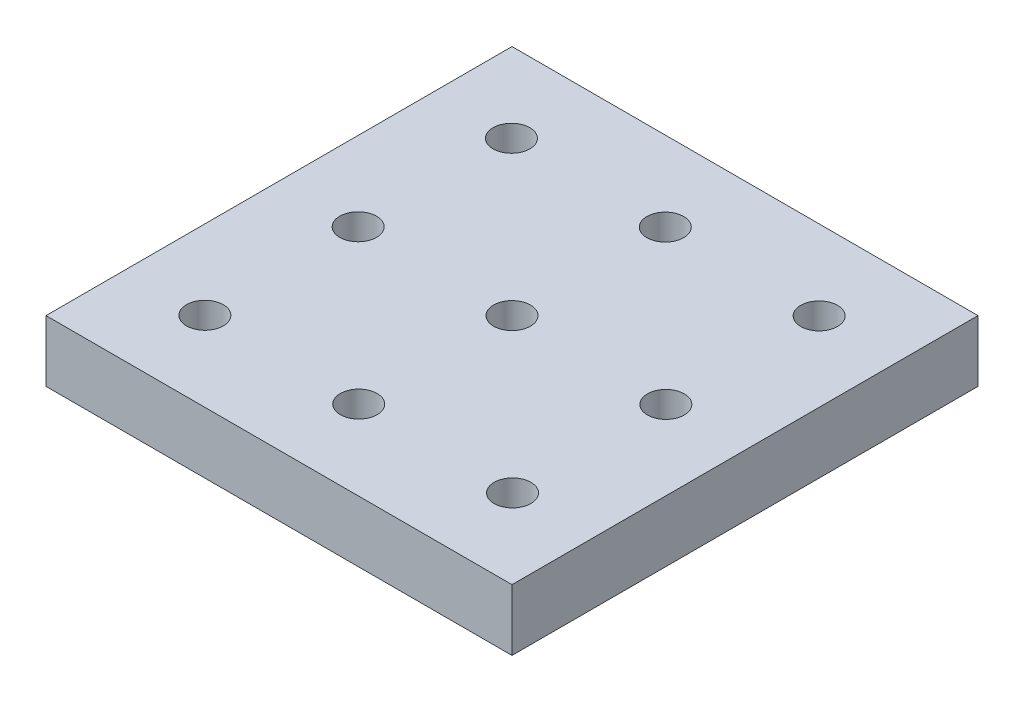
ISO-10303-21;
HEADER;
FILE_DESCRIPTION(('STEP AP214'),'2;1');
FILE_NAME('part.step','',(''),(''),'','','');
FILE_SCHEMA(('AUTOMOTIVE_DESIGN { 1 0 10303 214 1 1 1 1 }'));
ENDSEC;
DATA;
#1=APPLICATION_CONTEXT('core data for automotive mechanical design processes');
#2=APPLICATION_PROTOCOL_DEFINITION('international standard','automotive_design',2000,#1);
#3=PRODUCT_CONTEXT('',#1,'mechanical');
#4=PRODUCT('Part','Part','',(#3));
#5=PRODUCT_RELATED_PRODUCT_CATEGORY('part','',(#4));
#6=PRODUCT_DEFINITION_FORMATION('','',#4);
#7=PRODUCT_DEFINITION_CONTEXT('part definition',#1,'design');
#8=PRODUCT_DEFINITION('design','',#6,#7);
#9=PRODUCT_DEFINITION_SHAPE('','',#8);
#10=(LENGTH_UNIT() NAMED_UNIT(*) SI_UNIT(.MILLI.,.METRE.));
#11=(NAMED_UNIT(*) PLANE_ANGLE_UNIT() SI_UNIT($,.RADIAN.));
#12=(NAMED_UNIT(*) SI_UNIT($,.STERADIAN.) SOLID_ANGLE_UNIT());
#13=UNCERTAINTY_MEASURE_WITH_UNIT(LENGTH_MEASURE(1.E-05),#10,'distance_accuracy_value','');
#14=(GEOMETRIC_REPRESENTATION_CONTEXT(3) GLOBAL_UNCERTAINTY_ASSIGNED_CONTEXT((#13)) GLOBAL_UNIT_ASSIGNED_CONTEXT((#10,
#11,#12)) REPRESENTATION_CONTEXT('',''));
#15=CARTESIAN_POINT('',(0.,0.,0.));
#16=DIRECTION('',(0.,0.,1.));
#17=DIRECTION('',(1.,0.,0.));
#18=AXIS2_PLACEMENT_3D('',#15,#16,#17);
#19=CARTESIAN_POINT('',(0.,10.,0.));
#20=DIRECTION('',(0.,1.,0.));
#21=DIRECTION('',(0.,0.,1.));
#22=AXIS2_PLACEMENT_3D('',#19,#20,#21);
#23=PLANE('',#22);
#24=CARTESIAN_POINT('',(-159.859666299944,10.,-56.7102196791404));
#25=DIRECTION('',(0.,1.,0.));
#26=DIRECTION('',(0.,0.,-1.));
#27=AXIS2_PLACEMENT_3D('',#24,#25,#26);
#28=CIRCLE('',#27,2.99999999999999);
#29=CARTESIAN_POINT('',(-159.859666299944,10.,-59.7102196791404));
#30=VERTEX_POINT('',#29);
#31=EDGE_CURVE('E150',#30,#30,#28,.T.);
#32=ORIENTED_EDGE('',*,*,#31,.F.);
#33=EDGE_LOOP('',(#32));
#34=FACE_BOUND('',#33,.T.);
#35=CARTESIAN_POINT('',(-134.769453056282,10.,-106.71021967914));
#36=DIRECTION('',(0.,1.,0.));
#37=DIRECTION('',(0.,0.,1.));
#38=AXIS2_PLACEMENT_3D('',#35,#36,#37);
#39=CIRCLE('',#38,2.99999999999999);
#40=CARTESIAN_POINT('',(-134.769453056282,10.,-103.71021967914));
#41=VERTEX_POINT('',#40);
#42=EDGE_CURVE('E138',#41,#41,#39,.T.);
#43=ORIENTED_EDGE('',*,*,#42,.F.);
#44=EDGE_LOOP('',(#43));
#45=FACE_BOUND('',#44,.T.);
#46=CARTESIAN_POINT('',(-134.769453056282,10.,-56.7102196791404));
#47=DIRECTION('',(0.,1.,0.));
#48=DIRECTION('',(0.,0.,-1.));
#49=AXIS2_PLACEMENT_3D('',#46,#47,#48);
#50=CIRCLE('',#49,2.99999999999999);
#51=CARTESIAN_POINT('',(-134.769453056282,10.,-59.7102196791404));
#52=VERTEX_POINT('',#51);
#53=EDGE_CURVE('E126',#52,#52,#50,.T.);
#54=ORIENTED_EDGE('',*,*,#53,.F.);
#55=EDGE_LOOP('',(#54));
#56=FACE_BOUND('',#55,.T.);
#57=CARTESIAN_POINT('',(-134.769453056282,10.,-81.7102196791404));
#58=DIRECTION('',(0.,1.,0.));
#59=DIRECTION('',(0.,0.,1.));
#60=AXIS2_PLACEMENT_3D('',#57,#58,#59);
#61=CIRCLE('',#60,3.00000000000002);
#62=CARTESIAN_POINT('',(-134.769453056282,10.,-78.7102196791404));
#63=VERTEX_POINT('',#62);
#64=EDGE_CURVE('E114',#63,#63,#61,.T.);
#65=ORIENTED_EDGE('',*,*,#64,.F.);
#66=EDGE_LOOP('',(#65));
#67=FACE_BOUND('',#66,.T.);
#68=DIRECTION('',(1.,0.,0.));
#69=VECTOR('',#68,1.);
#70=CARTESIAN_POINT('',(-197.859666299944,10.,-43.7102196791404));
#71=LINE('',#70,#69);
#72=CARTESIAN_POINT('',(-197.859666299944,10.,-43.7102196791404));
#73=VERTEX_POINT('',#72);
#74=CARTESIAN_POINT('',(-121.859666299944,10.,-43.7102196791404));
#75=VERTEX_POINT('',#74);
#76=EDGE_CURVE('E84',#73,#75,#71,.T.);
#77=ORIENTED_EDGE('',*,*,#76,.T.);
#78=DIRECTION('',(0.,0.,-1.));
#79=VECTOR('',#78,1.);
#80=CARTESIAN_POINT('',(-121.859666299944,10.,-43.7102196791404));
#81=LINE('',#80,#79);
#82=CARTESIAN_POINT('',(-121.859666299944,10.,-119.71021967914));
#83=VERTEX_POINT('',#82);
#84=EDGE_CURVE('E79',#75,#83,#81,.T.);
#85=ORIENTED_EDGE('',*,*,#84,.T.);
#86=DIRECTION('',(-1.,0.,0.));
#87=VECTOR('',#86,1.);
#88=CARTESIAN_POINT('',(-121.859666299944,10.,-119.71021967914));
#89=LINE('',#88,#87);
#90=CARTESIAN_POINT('',(-197.859666299944,10.,-119.71021967914));
#91=VERTEX_POINT('',#90);
#92=EDGE_CURVE('E82',#83,#91,#89,.T.);
#93=ORIENTED_EDGE('',*,*,#92,.T.);
#94=DIRECTION('',(0.,0.,1.));
#95=VECTOR('',#94,1.);
#96=CARTESIAN_POINT('',(-197.859666299944,10.,-119.71021967914));
#97=LINE('',#96,#95);
#98=EDGE_CURVE('E49',#91,#73,#97,.T.);
#99=ORIENTED_EDGE('',*,*,#98,.T.);
#100=EDGE_LOOP('',(#77,#85,#93,#99));
#101=FACE_BOUND('',#100,.T.);
#102=CARTESIAN_POINT('',(-159.859666299944,10.,-81.7102196791404));
#103=DIRECTION('',(0.,1.,0.));
#104=DIRECTION('',(0.,0.,1.));
#105=AXIS2_PLACEMENT_3D('',#102,#103,#104);
#106=CIRCLE('',#105,2.99999999999999);
#107=CARTESIAN_POINT('',(-159.859666299944,10.,-78.7102196791404));
#108=VERTEX_POINT('',#107);
#109=EDGE_CURVE('E99',#108,#108,#106,.T.);
#110=ORIENTED_EDGE('',*,*,#109,.F.);
#111=EDGE_LOOP('',(#110));
#112=FACE_BOUND('',#111,.T.);
#113=CARTESIAN_POINT('',(-184.949879543606,10.,-81.7102196791404));
#114=DIRECTION('',(0.,1.,0.));
#115=DIRECTION('',(0.,0.,-1.));
#116=AXIS2_PLACEMENT_3D('',#113,#114,#115);
#117=CIRCLE('',#116,3.00000000000002);
#118=CARTESIAN_POINT('',(-184.949879543606,10.,-84.7102196791404));
#119=VERTEX_POINT('',#118);
#120=EDGE_CURVE('E120',#119,#119,#117,.T.);
#121=ORIENTED_EDGE('',*,*,#120,.F.);
#122=EDGE_LOOP('',(#121));
#123=FACE_BOUND('',#122,.T.);
#124=CARTESIAN_POINT('',(-159.859666299944,10.,-106.71021967914));
#125=DIRECTION('',(0.,1.,0.));
#126=DIRECTION('',(0.,0.,1.));
#127=AXIS2_PLACEMENT_3D('',#124,#125,#126);
#128=CIRCLE('',#127,2.99999999999999);
#129=CARTESIAN_POINT('',(-159.859666299944,10.,-103.71021967914));
#130=VERTEX_POINT('',#129);
#131=EDGE_CURVE('E132',#130,#130,#128,.T.);
#132=ORIENTED_EDGE('',*,*,#131,.F.);
#133=EDGE_LOOP('',(#132));
#134=FACE_BOUND('',#133,.T.);
#135=CARTESIAN_POINT('',(-184.949879543606,10.,-106.71021967914));
#136=DIRECTION('',(0.,1.,0.));
#137=DIRECTION('',(0.,0.,-1.));
#138=AXIS2_PLACEMENT_3D('',#135,#136,#137);
#139=CIRCLE('',#138,3.00000000000002);
#140=CARTESIAN_POINT('',(-184.949879543606,10.,-109.71021967914));
#141=VERTEX_POINT('',#140);
#142=EDGE_CURVE('E144',#141,#141,#139,.T.);
#143=ORIENTED_EDGE('',*,*,#142,.F.);
#144=EDGE_LOOP('',(#143));
#145=FACE_BOUND('',#144,.T.);
#146=CARTESIAN_POINT('',(-184.949879543606,10.,-56.7102196791404));
#147=DIRECTION('',(0.,1.,0.));
#148=DIRECTION('',(0.,0.,1.));
#149=AXIS2_PLACEMENT_3D('',#146,#147,#148);
#150=CIRCLE('',#149,3.00000000000002);
#151=CARTESIAN_POINT('',(-184.949879543606,10.,-53.7102196791404));
#152=VERTEX_POINT('',#151);
#153=EDGE_CURVE('E156',#152,#152,#150,.T.);
#154=ORIENTED_EDGE('',*,*,#153,.F.);
#155=EDGE_LOOP('',(#154));
#156=FACE_BOUND('',#155,.T.);
#157=ADVANCED_FACE('F32',(#34,#45,#56,#67,#101,#112,#123,#134,#145,#156),#23,.T.);
#158=CARTESIAN_POINT('',(0.,0.,0.));
#159=DIRECTION('',(0.,1.,0.));
#160=DIRECTION('',(0.,0.,1.));
#161=AXIS2_PLACEMENT_3D('',#158,#159,#160);
#162=PLANE('',#161);
#163=CARTESIAN_POINT('',(-159.859666299944,0.,-56.7102196791404));
#164=DIRECTION('',(0.,1.,0.));
#165=DIRECTION('',(0.,0.,-1.));
#166=AXIS2_PLACEMENT_3D('',#163,#164,#165);
#167=CIRCLE('',#166,2.99999999999999);
#168=CARTESIAN_POINT('',(-159.859666299944,0.,-59.7102196791404));
#169=VERTEX_POINT('',#168);
#170=EDGE_CURVE('E153',#169,#169,#167,.T.);
#171=ORIENTED_EDGE('',*,*,#170,.T.);
#172=EDGE_LOOP('',(#171));
#173=FACE_BOUND('',#172,.T.);
#174=CARTESIAN_POINT('',(-134.769453056282,0.,-106.71021967914));
#175=DIRECTION('',(0.,1.,0.));
#176=DIRECTION('',(0.,0.,1.));
#177=AXIS2_PLACEMENT_3D('',#174,#175,#176);
#178=CIRCLE('',#177,2.99999999999999);
#179=CARTESIAN_POINT('',(-134.769453056282,0.,-103.71021967914));
#180=VERTEX_POINT('',#179);
#181=EDGE_CURVE('E141',#180,#180,#178,.T.);
#182=ORIENTED_EDGE('',*,*,#181,.T.);
#183=EDGE_LOOP('',(#182));
#184=FACE_BOUND('',#183,.T.);
#185=CARTESIAN_POINT('',(-134.769453056282,0.,-56.7102196791404));
#186=DIRECTION('',(0.,1.,0.));
#187=DIRECTION('',(0.,0.,-1.));
#188=AXIS2_PLACEMENT_3D('',#185,#186,#187);
#189=CIRCLE('',#188,2.99999999999999);
#190=CARTESIAN_POINT('',(-134.769453056282,0.,-59.7102196791404));
#191=VERTEX_POINT('',#190);
#192=EDGE_CURVE('E129',#191,#191,#189,.T.);
#193=ORIENTED_EDGE('',*,*,#192,.T.);
#194=EDGE_LOOP('',(#193));
#195=FACE_BOUND('',#194,.T.);
#196=CARTESIAN_POINT('',(-134.769453056282,0.,-81.7102196791404));
#197=DIRECTION('',(0.,1.,0.));
#198=DIRECTION('',(0.,0.,1.));
#199=AXIS2_PLACEMENT_3D('',#196,#197,#198);
#200=CIRCLE('',#199,3.00000000000002);
#201=CARTESIAN_POINT('',(-134.769453056282,0.,-78.7102196791404));
#202=VERTEX_POINT('',#201);
#203=EDGE_CURVE('E117',#202,#202,#200,.T.);
#204=ORIENTED_EDGE('',*,*,#203,.T.);
#205=EDGE_LOOP('',(#204));
#206=FACE_BOUND('',#205,.T.);
#207=DIRECTION('',(1.,0.,0.));
#208=VECTOR('',#207,1.);
#209=CARTESIAN_POINT('',(-197.859666299944,0.,-43.7102196791404));
#210=LINE('',#209,#208);
#211=CARTESIAN_POINT('',(-197.859666299944,0.,-43.7102196791404));
#212=VERTEX_POINT('',#211);
#213=CARTESIAN_POINT('',(-121.859666299944,0.,-43.7102196791404));
#214=VERTEX_POINT('',#213);
#215=EDGE_CURVE('E96',#212,#214,#210,.T.);
#216=ORIENTED_EDGE('',*,*,#215,.F.);
#217=DIRECTION('',(0.,0.,1.));
#218=VECTOR('',#217,1.);
#219=CARTESIAN_POINT('',(-197.859666299944,0.,-119.71021967914));
#220=LINE('',#219,#218);
#221=CARTESIAN_POINT('',(-197.859666299944,0.,-119.71021967914));
#222=VERTEX_POINT('',#221);
#223=EDGE_CURVE('E72',#222,#212,#220,.T.);
#224=ORIENTED_EDGE('',*,*,#223,.F.);
#225=DIRECTION('',(-1.,0.,0.));
#226=VECTOR('',#225,1.);
#227=CARTESIAN_POINT('',(-121.859666299944,0.,-119.71021967914));
#228=LINE('',#227,#226);
#229=CARTESIAN_POINT('',(-121.859666299944,0.,-119.71021967914));
#230=VERTEX_POINT('',#229);
#231=EDGE_CURVE('E66',#230,#222,#228,.T.);
#232=ORIENTED_EDGE('',*,*,#231,.F.);
#233=DIRECTION('',(0.,0.,-1.));
#234=VECTOR('',#233,1.);
#235=CARTESIAN_POINT('',(-121.859666299944,0.,-43.7102196791404));
#236=LINE('',#235,#234);
#237=EDGE_CURVE('E88',#214,#230,#236,.T.);
#238=ORIENTED_EDGE('',*,*,#237,.F.);
#239=EDGE_LOOP('',(#216,#224,#232,#238));
#240=FACE_BOUND('',#239,.T.);
#241=CARTESIAN_POINT('',(-159.859666299944,0.,-81.7102196791404));
#242=DIRECTION('',(0.,1.,0.));
#243=DIRECTION('',(0.,0.,1.));
#244=AXIS2_PLACEMENT_3D('',#241,#242,#243);
#245=CIRCLE('',#244,2.99999999999999);
#246=CARTESIAN_POINT('',(-159.859666299944,0.,-78.7102196791404));
#247=VERTEX_POINT('',#246);
#248=EDGE_CURVE('E111',#247,#247,#245,.T.);
#249=ORIENTED_EDGE('',*,*,#248,.T.);
#250=EDGE_LOOP('',(#249));
#251=FACE_BOUND('',#250,.T.);
#252=CARTESIAN_POINT('',(-184.949879543606,0.,-81.7102196791404));
#253=DIRECTION('',(0.,1.,0.));
#254=DIRECTION('',(0.,0.,-1.));
#255=AXIS2_PLACEMENT_3D('',#252,#253,#254);
#256=CIRCLE('',#255,3.00000000000002);
#257=CARTESIAN_POINT('',(-184.949879543606,0.,-84.7102196791404));
#258=VERTEX_POINT('',#257);
#259=EDGE_CURVE('E123',#258,#258,#256,.T.);
#260=ORIENTED_EDGE('',*,*,#259,.T.);
#261=EDGE_LOOP('',(#260));
#262=FACE_BOUND('',#261,.T.);
#263=CARTESIAN_POINT('',(-159.859666299944,0.,-106.71021967914));
#264=DIRECTION('',(0.,1.,0.));
#265=DIRECTION('',(0.,0.,1.));
#266=AXIS2_PLACEMENT_3D('',#263,#264,#265);
#267=CIRCLE('',#266,2.99999999999999);
#268=CARTESIAN_POINT('',(-159.859666299944,0.,-103.71021967914));
#269=VERTEX_POINT('',#268);
#270=EDGE_CURVE('E135',#269,#269,#267,.T.);
#271=ORIENTED_EDGE('',*,*,#270,.T.);
#272=EDGE_LOOP('',(#271));
#273=FACE_BOUND('',#272,.T.);
#274=CARTESIAN_POINT('',(-184.949879543606,0.,-106.71021967914));
#275=DIRECTION('',(0.,1.,0.));
#276=DIRECTION('',(0.,0.,-1.));
#277=AXIS2_PLACEMENT_3D('',#274,#275,#276);
#278=CIRCLE('',#277,3.00000000000002);
#279=CARTESIAN_POINT('',(-184.949879543606,0.,-109.71021967914));
#280=VERTEX_POINT('',#279);
#281=EDGE_CURVE('E147',#280,#280,#278,.T.);
#282=ORIENTED_EDGE('',*,*,#281,.T.);
#283=EDGE_LOOP('',(#282));
#284=FACE_BOUND('',#283,.T.);
#285=CARTESIAN_POINT('',(-184.949879543606,0.,-56.7102196791404));
#286=DIRECTION('',(0.,1.,0.));
#287=DIRECTION('',(0.,0.,1.));
#288=AXIS2_PLACEMENT_3D('',#285,#286,#287);
#289=CIRCLE('',#288,3.00000000000002);
#290=CARTESIAN_POINT('',(-184.949879543606,0.,-53.7102196791404));
#291=VERTEX_POINT('',#290);
#292=EDGE_CURVE('E159',#291,#291,#289,.T.);
#293=ORIENTED_EDGE('',*,*,#292,.T.);
#294=EDGE_LOOP('',(#293));
#295=FACE_BOUND('',#294,.T.);
#296=ADVANCED_FACE('F107',(#173,#184,#195,#206,#240,#251,#262,#273,#284,#295),#162,.F.);
#297=CARTESIAN_POINT('',(-197.859666299944,10.,-43.7102196791404));
#298=DIRECTION('',(0.,0.,-1.));
#299=DIRECTION('',(-1.,0.,0.));
#300=AXIS2_PLACEMENT_3D('',#297,#298,#299);
#301=PLANE('',#300);
#302=ORIENTED_EDGE('',*,*,#215,.T.);
#303=DIRECTION('',(0.,-1.,0.));
#304=VECTOR('',#303,1.);
#305=CARTESIAN_POINT('',(-121.859666299944,10.,-43.7102196791404));
#306=LINE('',#305,#304);
#307=EDGE_CURVE('E11',#75,#214,#306,.T.);
#308=ORIENTED_EDGE('',*,*,#307,.F.);
#309=ORIENTED_EDGE('',*,*,#76,.F.);
#310=DIRECTION('',(0.,-1.,0.));
#311=VECTOR('',#310,1.);
#312=CARTESIAN_POINT('',(-197.859666299944,10.,-43.7102196791404));
#313=LINE('',#312,#311);
#314=EDGE_CURVE('E92',#73,#212,#313,.T.);
#315=ORIENTED_EDGE('',*,*,#314,.T.);
#316=EDGE_LOOP('',(#302,#308,#309,#315));
#317=FACE_BOUND('',#316,.T.);
#318=ADVANCED_FACE('F34',(#317),#301,.F.);
#319=CARTESIAN_POINT('',(-121.859666299944,10.,-43.7102196791404));
#320=DIRECTION('',(-1.,0.,0.));
#321=DIRECTION('',(0.,0.,1.));
#322=AXIS2_PLACEMENT_3D('',#319,#320,#321);
#323=PLANE('',#322);
#324=ORIENTED_EDGE('',*,*,#237,.T.);
#325=DIRECTION('',(0.,-1.,0.));
#326=VECTOR('',#325,1.);
#327=CARTESIAN_POINT('',(-121.859666299944,10.,-119.71021967914));
#328=LINE('',#327,#326);
#329=EDGE_CURVE('E41',#83,#230,#328,.T.);
#330=ORIENTED_EDGE('',*,*,#329,.F.);
#331=ORIENTED_EDGE('',*,*,#84,.F.);
#332=ORIENTED_EDGE('',*,*,#307,.T.);
#333=EDGE_LOOP('',(#324,#330,#331,#332));
#334=FACE_BOUND('',#333,.T.);
#335=ADVANCED_FACE('F87',(#334),#323,.F.);
#336=CARTESIAN_POINT('',(-121.859666299944,10.,-119.71021967914));
#337=DIRECTION('',(0.,0.,1.));
#338=DIRECTION('',(1.,0.,0.));
#339=AXIS2_PLACEMENT_3D('',#336,#337,#338);
#340=PLANE('',#339);
#341=ORIENTED_EDGE('',*,*,#231,.T.);
#342=DIRECTION('',(0.,-1.,0.));
#343=VECTOR('',#342,1.);
#344=CARTESIAN_POINT('',(-197.859666299944,10.,-119.71021967914));
#345=LINE('',#344,#343);
#346=EDGE_CURVE('E89',#91,#222,#345,.T.);
#347=ORIENTED_EDGE('',*,*,#346,.F.);
#348=ORIENTED_EDGE('',*,*,#92,.F.);
#349=ORIENTED_EDGE('',*,*,#329,.T.);
#350=EDGE_LOOP('',(#341,#347,#348,#349));
#351=FACE_BOUND('',#350,.T.);
#352=ADVANCED_FACE('F90',(#351),#340,.F.);
#353=CARTESIAN_POINT('',(-197.859666299944,10.,-119.71021967914));
#354=DIRECTION('',(1.,0.,0.));
#355=DIRECTION('',(0.,0.,-1.));
#356=AXIS2_PLACEMENT_3D('',#353,#354,#355);
#357=PLANE('',#356);
#358=ORIENTED_EDGE('',*,*,#223,.T.);
#359=ORIENTED_EDGE('',*,*,#314,.F.);
#360=ORIENTED_EDGE('',*,*,#98,.F.);
#361=ORIENTED_EDGE('',*,*,#346,.T.);
#362=EDGE_LOOP('',(#358,#359,#360,#361));
#363=FACE_BOUND('',#362,.T.);
#364=ADVANCED_FACE('F104',(#363),#357,.F.);
#365=CARTESIAN_POINT('',(-159.859666299944,10.,-81.7102196791404));
#366=DIRECTION('',(0.,-1.,0.));
#367=DIRECTION('',(0.,0.,-1.));
#368=AXIS2_PLACEMENT_3D('',#365,#366,#367);
#369=CYLINDRICAL_SURFACE('',#368,2.99999999999999);
#370=ORIENTED_EDGE('',*,*,#109,.T.);
#371=EDGE_LOOP('',(#370));
#372=FACE_BOUND('',#371,.T.);
#373=ORIENTED_EDGE('',*,*,#248,.F.);
#374=EDGE_LOOP('',(#373));
#375=FACE_BOUND('',#374,.T.);
#376=ADVANCED_FACE('F179',(#372,#375),#369,.F.);
#377=CARTESIAN_POINT('',(-134.769453056282,10.,-81.7102196791404));
#378=DIRECTION('',(0.,-1.,0.));
#379=DIRECTION('',(0.,0.,-1.));
#380=AXIS2_PLACEMENT_3D('',#377,#378,#379);
#381=CYLINDRICAL_SURFACE('',#380,3.00000000000002);
#382=ORIENTED_EDGE('',*,*,#64,.T.);
#383=EDGE_LOOP('',(#382));
#384=FACE_BOUND('',#383,.T.);
#385=ORIENTED_EDGE('',*,*,#203,.F.);
#386=EDGE_LOOP('',(#385));
#387=FACE_BOUND('',#386,.T.);
#388=ADVANCED_FACE('F225',(#384,#387),#381,.F.);
#389=CARTESIAN_POINT('',(-184.949879543606,10.,-81.7102196791404));
#390=DIRECTION('',(0.,-1.,0.));
#391=DIRECTION('',(0.,0.,-1.));
#392=AXIS2_PLACEMENT_3D('',#389,#390,#391);
#393=CYLINDRICAL_SURFACE('',#392,3.00000000000002);
#394=ORIENTED_EDGE('',*,*,#120,.T.);
#395=EDGE_LOOP('',(#394));
#396=FACE_BOUND('',#395,.T.);
#397=ORIENTED_EDGE('',*,*,#259,.F.);
#398=EDGE_LOOP('',(#397));
#399=FACE_BOUND('',#398,.T.);
#400=ADVANCED_FACE('F233',(#396,#399),#393,.F.);
#401=CARTESIAN_POINT('',(-134.769453056282,10.,-56.7102196791404));
#402=DIRECTION('',(0.,-1.,0.));
#403=DIRECTION('',(0.,0.,-1.));
#404=AXIS2_PLACEMENT_3D('',#401,#402,#403);
#405=CYLINDRICAL_SURFACE('',#404,2.99999999999999);
#406=ORIENTED_EDGE('',*,*,#53,.T.);
#407=EDGE_LOOP('',(#406));
#408=FACE_BOUND('',#407,.T.);
#409=ORIENTED_EDGE('',*,*,#192,.F.);
#410=EDGE_LOOP('',(#409));
#411=FACE_BOUND('',#410,.T.);
#412=ADVANCED_FACE('F241',(#408,#411),#405,.F.);
#413=CARTESIAN_POINT('',(-159.859666299944,10.,-106.71021967914));
#414=DIRECTION('',(0.,-1.,0.));
#415=DIRECTION('',(0.,0.,-1.));
#416=AXIS2_PLACEMENT_3D('',#413,#414,#415);
#417=CYLINDRICAL_SURFACE('',#416,2.99999999999999);
#418=ORIENTED_EDGE('',*,*,#131,.T.);
#419=EDGE_LOOP('',(#418));
#420=FACE_BOUND('',#419,.T.);
#421=ORIENTED_EDGE('',*,*,#270,.F.);
#422=EDGE_LOOP('',(#421));
#423=FACE_BOUND('',#422,.T.);
#424=ADVANCED_FACE('F250',(#420,#423),#417,.F.);
#425=CARTESIAN_POINT('',(-134.769453056282,10.,-106.71021967914));
#426=DIRECTION('',(0.,-1.,0.));
#427=DIRECTION('',(0.,0.,-1.));
#428=AXIS2_PLACEMENT_3D('',#425,#426,#427);
#429=CYLINDRICAL_SURFACE('',#428,2.99999999999999);
#430=ORIENTED_EDGE('',*,*,#42,.T.);
#431=EDGE_LOOP('',(#430));
#432=FACE_BOUND('',#431,.T.);
#433=ORIENTED_EDGE('',*,*,#181,.F.);
#434=EDGE_LOOP('',(#433));
#435=FACE_BOUND('',#434,.T.);
#436=ADVANCED_FACE('F259',(#432,#435),#429,.F.);
#437=CARTESIAN_POINT('',(-184.949879543606,10.,-106.71021967914));
#438=DIRECTION('',(0.,-1.,0.));
#439=DIRECTION('',(0.,0.,-1.));
#440=AXIS2_PLACEMENT_3D('',#437,#438,#439);
#441=CYLINDRICAL_SURFACE('',#440,3.00000000000002);
#442=ORIENTED_EDGE('',*,*,#142,.T.);
#443=EDGE_LOOP('',(#442));
#444=FACE_BOUND('',#443,.T.);
#445=ORIENTED_EDGE('',*,*,#281,.F.);
#446=EDGE_LOOP('',(#445));
#447=FACE_BOUND('',#446,.T.);
#448=ADVANCED_FACE('F268',(#444,#447),#441,.F.);
#449=CARTESIAN_POINT('',(-159.859666299944,10.,-56.7102196791404));
#450=DIRECTION('',(0.,-1.,0.));
#451=DIRECTION('',(0.,0.,-1.));
#452=AXIS2_PLACEMENT_3D('',#449,#450,#451);
#453=CYLINDRICAL_SURFACE('',#452,2.99999999999999);
#454=ORIENTED_EDGE('',*,*,#31,.T.);
#455=EDGE_LOOP('',(#454));
#456=FACE_BOUND('',#455,.T.);
#457=ORIENTED_EDGE('',*,*,#170,.F.);
#458=EDGE_LOOP('',(#457));
#459=FACE_BOUND('',#458,.T.);
#460=ADVANCED_FACE('F277',(#456,#459),#453,.F.);
#461=CARTESIAN_POINT('',(-184.949879543606,10.,-56.7102196791404));
#462=DIRECTION('',(0.,-1.,0.));
#463=DIRECTION('',(0.,0.,-1.));
#464=AXIS2_PLACEMENT_3D('',#461,#462,#463);
#465=CYLINDRICAL_SURFACE('',#464,3.00000000000002);
#466=ORIENTED_EDGE('',*,*,#153,.T.);
#467=EDGE_LOOP('',(#466));
#468=FACE_BOUND('',#467,.T.);
#469=ORIENTED_EDGE('',*,*,#292,.F.);
#470=EDGE_LOOP('',(#469));
#471=FACE_BOUND('',#470,.T.);
#472=ADVANCED_FACE('F165',(#468,#471),#465,.F.);
#473=CLOSED_SHELL('',(#157,#296,#318,#335,#352,#364,#376,#388,#400,#412,#424,#436,#448,#460,#472));
#474=MANIFOLD_SOLID_BREP('B2',#473);
#475=ADVANCED_BREP_SHAPE_REPRESENTATION('',(#18,#474),#14);
#476=SHAPE_DEFINITION_REPRESENTATION(#9,#475);
ENDSEC;
END-ISO-10303-21;
